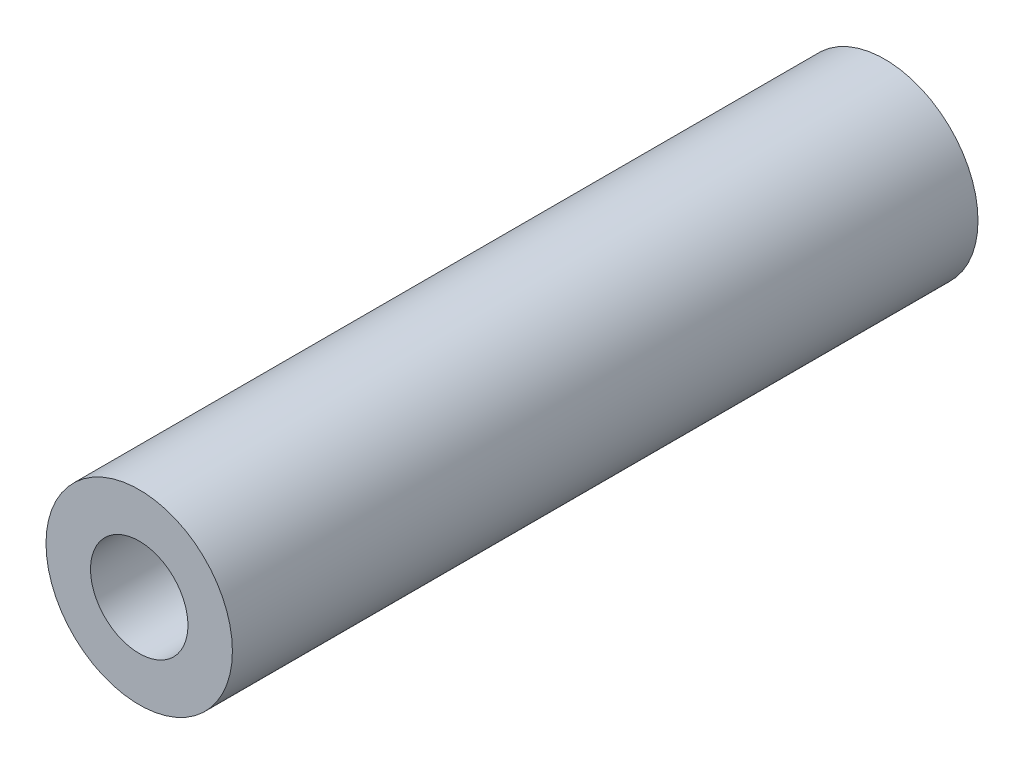
ISO-10303-21;
HEADER;
FILE_DESCRIPTION(('STEP AP214'),'2;1');
FILE_NAME('part.step','',(''),(''),'','','');
FILE_SCHEMA(('AUTOMOTIVE_DESIGN { 1 0 10303 214 1 1 1 1 }'));
ENDSEC;
DATA;
#1=APPLICATION_CONTEXT('core data for automotive mechanical design processes');
#2=APPLICATION_PROTOCOL_DEFINITION('international standard','automotive_design',2000,#1);
#3=PRODUCT_CONTEXT('',#1,'mechanical');
#4=PRODUCT('Part','Part','',(#3));
#5=PRODUCT_RELATED_PRODUCT_CATEGORY('part','',(#4));
#6=PRODUCT_DEFINITION_FORMATION('','',#4);
#7=PRODUCT_DEFINITION_CONTEXT('part definition',#1,'design');
#8=PRODUCT_DEFINITION('design','',#6,#7);
#9=PRODUCT_DEFINITION_SHAPE('','',#8);
#10=(LENGTH_UNIT() NAMED_UNIT(*) SI_UNIT(.MILLI.,.METRE.));
#11=(NAMED_UNIT(*) PLANE_ANGLE_UNIT() SI_UNIT($,.RADIAN.));
#12=(NAMED_UNIT(*) SI_UNIT($,.STERADIAN.) SOLID_ANGLE_UNIT());
#13=UNCERTAINTY_MEASURE_WITH_UNIT(LENGTH_MEASURE(1.E-05),#10,'distance_accuracy_value','');
#14=(GEOMETRIC_REPRESENTATION_CONTEXT(3) GLOBAL_UNCERTAINTY_ASSIGNED_CONTEXT((#13)) GLOBAL_UNIT_ASSIGNED_CONTEXT((#10,
#11,#12)) REPRESENTATION_CONTEXT('',''));
#15=CARTESIAN_POINT('',(0.,0.,0.));
#16=DIRECTION('',(0.,0.,1.));
#17=DIRECTION('',(1.,0.,0.));
#18=AXIS2_PLACEMENT_3D('',#15,#16,#17);
#19=CARTESIAN_POINT('',(0.,0.,38.1));
#20=DIRECTION('',(0.,0.,1.));
#21=DIRECTION('',(1.,0.,0.));
#22=AXIS2_PLACEMENT_3D('',#19,#20,#21);
#23=PLANE('',#22);
#24=CARTESIAN_POINT('',(0.,0.,38.1));
#25=DIRECTION('',(0.,0.,1.));
#26=DIRECTION('',(1.,0.,0.));
#27=AXIS2_PLACEMENT_3D('',#24,#25,#26);
#28=CIRCLE('',#27,4.7625);
#29=CARTESIAN_POINT('',(-4.7625,0.,38.1));
#30=VERTEX_POINT('',#29);
#31=EDGE_CURVE('E10',#30,#30,#28,.T.);
#32=ORIENTED_EDGE('',*,*,#31,.T.);
#33=EDGE_LOOP('',(#32));
#34=FACE_BOUND('',#33,.T.);
#35=CARTESIAN_POINT('',(0.,0.,38.1));
#36=DIRECTION('',(0.,0.,1.));
#37=DIRECTION('',(1.,0.,0.));
#38=AXIS2_PLACEMENT_3D('',#35,#36,#37);
#39=CIRCLE('',#38,2.4892);
#40=CARTESIAN_POINT('',(-2.4892,0.,38.1));
#41=VERTEX_POINT('',#40);
#42=EDGE_CURVE('E49',#41,#41,#39,.T.);
#43=ORIENTED_EDGE('',*,*,#42,.F.);
#44=EDGE_LOOP('',(#43));
#45=FACE_BOUND('',#44,.T.);
#46=ADVANCED_FACE('F38',(#34,#45),#23,.T.);
#47=CARTESIAN_POINT('',(0.,0.,0.));
#48=DIRECTION('',(0.,0.,1.));
#49=DIRECTION('',(1.,0.,0.));
#50=AXIS2_PLACEMENT_3D('',#47,#48,#49);
#51=PLANE('',#50);
#52=CARTESIAN_POINT('',(0.,0.,0.));
#53=DIRECTION('',(0.,0.,1.));
#54=DIRECTION('',(1.,0.,0.));
#55=AXIS2_PLACEMENT_3D('',#52,#53,#54);
#56=CIRCLE('',#55,4.7625);
#57=CARTESIAN_POINT('',(-4.7625,0.,0.));
#58=VERTEX_POINT('',#57);
#59=EDGE_CURVE('E42',#58,#58,#56,.T.);
#60=ORIENTED_EDGE('',*,*,#59,.F.);
#61=EDGE_LOOP('',(#60));
#62=FACE_BOUND('',#61,.T.);
#63=CARTESIAN_POINT('',(0.,0.,0.));
#64=DIRECTION('',(0.,0.,1.));
#65=DIRECTION('',(1.,0.,0.));
#66=AXIS2_PLACEMENT_3D('',#63,#64,#65);
#67=CIRCLE('',#66,2.4892);
#68=CARTESIAN_POINT('',(-2.4892,0.,0.));
#69=VERTEX_POINT('',#68);
#70=EDGE_CURVE('E51',#69,#69,#67,.T.);
#71=ORIENTED_EDGE('',*,*,#70,.T.);
#72=EDGE_LOOP('',(#71));
#73=FACE_BOUND('',#72,.T.);
#74=ADVANCED_FACE('F61',(#62,#73),#51,.F.);
#75=CARTESIAN_POINT('',(0.,0.,38.1));
#76=DIRECTION('',(0.,0.,-1.));
#77=DIRECTION('',(-1.,0.,0.));
#78=AXIS2_PLACEMENT_3D('',#75,#76,#77);
#79=CYLINDRICAL_SURFACE('',#78,4.7625);
#80=CARTESIAN_POINT('',(-4.7625,0.,38.1));
#81=CARTESIAN_POINT('',(-4.7625,0.,37.703125));
#82=CARTESIAN_POINT('',(-4.7625,0.,37.30625));
#83=CARTESIAN_POINT('',(-4.7625,0.,36.5125));
#84=CARTESIAN_POINT('',(-4.7625,0.,36.115625));
#85=CARTESIAN_POINT('',(-4.7625,0.,35.321875));
#86=CARTESIAN_POINT('',(-4.7625,0.,34.925));
#87=CARTESIAN_POINT('',(-4.7625,0.,34.13125));
#88=CARTESIAN_POINT('',(-4.7625,0.,33.734375));
#89=CARTESIAN_POINT('',(-4.7625,0.,32.940625));
#90=CARTESIAN_POINT('',(-4.7625,0.,32.54375));
#91=CARTESIAN_POINT('',(-4.7625,0.,31.75));
#92=CARTESIAN_POINT('',(-4.7625,0.,31.353125));
#93=CARTESIAN_POINT('',(-4.7625,0.,30.559375));
#94=CARTESIAN_POINT('',(-4.7625,0.,30.1625));
#95=CARTESIAN_POINT('',(-4.7625,0.,29.36875));
#96=CARTESIAN_POINT('',(-4.7625,0.,28.971875));
#97=CARTESIAN_POINT('',(-4.7625,0.,28.178125));
#98=CARTESIAN_POINT('',(-4.7625,0.,27.78125));
#99=CARTESIAN_POINT('',(-4.7625,0.,26.9875));
#100=CARTESIAN_POINT('',(-4.7625,0.,26.590625));
#101=CARTESIAN_POINT('',(-4.7625,0.,25.796875));
#102=CARTESIAN_POINT('',(-4.7625,0.,25.4));
#103=CARTESIAN_POINT('',(-4.7625,0.,24.60625));
#104=CARTESIAN_POINT('',(-4.7625,0.,24.209375));
#105=CARTESIAN_POINT('',(-4.7625,0.,23.415625));
#106=CARTESIAN_POINT('',(-4.7625,0.,23.01875));
#107=CARTESIAN_POINT('',(-4.7625,0.,22.225));
#108=CARTESIAN_POINT('',(-4.7625,0.,21.828125));
#109=CARTESIAN_POINT('',(-4.7625,0.,21.034375));
#110=CARTESIAN_POINT('',(-4.7625,0.,20.6375));
#111=CARTESIAN_POINT('',(-4.7625,0.,19.84375));
#112=CARTESIAN_POINT('',(-4.7625,0.,19.446875));
#113=CARTESIAN_POINT('',(-4.7625,0.,18.653125));
#114=CARTESIAN_POINT('',(-4.7625,0.,18.25625));
#115=CARTESIAN_POINT('',(-4.7625,0.,17.4625));
#116=CARTESIAN_POINT('',(-4.7625,0.,17.065625));
#117=CARTESIAN_POINT('',(-4.7625,0.,16.271875));
#118=CARTESIAN_POINT('',(-4.7625,0.,15.875));
#119=CARTESIAN_POINT('',(-4.7625,0.,15.08125));
#120=CARTESIAN_POINT('',(-4.7625,0.,14.684375));
#121=CARTESIAN_POINT('',(-4.7625,0.,13.890625));
#122=CARTESIAN_POINT('',(-4.7625,0.,13.49375));
#123=CARTESIAN_POINT('',(-4.7625,0.,12.7));
#124=CARTESIAN_POINT('',(-4.7625,0.,12.303125));
#125=CARTESIAN_POINT('',(-4.7625,0.,11.509375));
#126=CARTESIAN_POINT('',(-4.7625,0.,11.1125));
#127=CARTESIAN_POINT('',(-4.7625,0.,10.31875));
#128=CARTESIAN_POINT('',(-4.7625,0.,9.92187499999999));
#129=CARTESIAN_POINT('',(-4.7625,0.,9.128125));
#130=CARTESIAN_POINT('',(-4.7625,0.,8.73124999999999));
#131=CARTESIAN_POINT('',(-4.7625,0.,7.93749999999999));
#132=CARTESIAN_POINT('',(-4.7625,0.,7.54062499999999));
#133=CARTESIAN_POINT('',(-4.7625,0.,6.746875));
#134=CARTESIAN_POINT('',(-4.7625,0.,6.35));
#135=CARTESIAN_POINT('',(-4.7625,0.,5.55625));
#136=CARTESIAN_POINT('',(-4.7625,0.,5.159375));
#137=CARTESIAN_POINT('',(-4.7625,0.,4.365625));
#138=CARTESIAN_POINT('',(-4.7625,0.,3.96875));
#139=CARTESIAN_POINT('',(-4.7625,0.,3.175));
#140=CARTESIAN_POINT('',(-4.7625,0.,2.778125));
#141=CARTESIAN_POINT('',(-4.7625,0.,1.984375));
#142=CARTESIAN_POINT('',(-4.7625,0.,1.5875));
#143=CARTESIAN_POINT('',(-4.7625,0.,0.79375));
#144=CARTESIAN_POINT('',(-4.7625,0.,0.396875));
#145=CARTESIAN_POINT('',(-4.7625,0.,0.));
#146=B_SPLINE_CURVE_WITH_KNOTS('',3,(#80,#81,#82,#83,#84,#85,#86,#87,#88,#89,#90,#91,#92,#93,
#94,#95,#96,#97,#98,#99,#100,#101,#102,#103,#104,#105,#106,#107,#108,#109,#110,#111,#112,#113,
#114,#115,#116,#117,#118,#119,#120,#121,#122,#123,#124,#125,#126,#127,#128,#129,#130,#131,#132,
#133,#134,#135,#136,#137,#138,#139,#140,#141,#142,#143,#144,#145),.UNSPECIFIED.,.F.,.F.,(4,2,2,
2,2,2,2,2,2,2,2,2,2,2,2,2,2,2,2,2,2,2,2,2,2,2,2,2,2,2,2,2,4),(0.,1.190625,2.38125,3.571875,
4.7625,5.953125,7.14375,8.334375,9.52500000000001,10.715625,11.90625,13.096875,14.2875,
15.478125,16.66875,17.859375,19.05,20.240625,21.43125,22.621875,23.8125,25.003125,26.19375,
27.384375,28.575,29.765625,30.95625,32.146875,33.3375,34.528125,35.71875,36.909375,38.1),.UNSPECIFIED.);
#147=EDGE_CURVE('BSEAM40',#30,#58,#146,.T.);
#148=ORIENTED_EDGE('',*,*,#31,.F.);
#149=ORIENTED_EDGE('',*,*,#59,.T.);
#150=ORIENTED_EDGE('',*,*,#147,.T.);
#151=ORIENTED_EDGE('',*,*,#147,.F.);
#152=EDGE_LOOP('',(#148,#150,#149,#151));
#153=FACE_BOUND('',#152,.T.);
#154=ADVANCED_FACE('F40',(#153),#79,.T.);
#155=CARTESIAN_POINT('',(0.,0.,38.1));
#156=DIRECTION('',(0.,0.,-1.));
#157=DIRECTION('',(-1.,0.,0.));
#158=AXIS2_PLACEMENT_3D('',#155,#156,#157);
#159=CYLINDRICAL_SURFACE('',#158,2.4892);
#160=CARTESIAN_POINT('',(-2.4892,0.,38.1));
#161=CARTESIAN_POINT('',(-2.4892,0.,37.703125));
#162=CARTESIAN_POINT('',(-2.4892,0.,37.30625));
#163=CARTESIAN_POINT('',(-2.4892,0.,36.5125));
#164=CARTESIAN_POINT('',(-2.4892,0.,36.115625));
#165=CARTESIAN_POINT('',(-2.4892,0.,35.321875));
#166=CARTESIAN_POINT('',(-2.4892,0.,34.925));
#167=CARTESIAN_POINT('',(-2.4892,0.,34.13125));
#168=CARTESIAN_POINT('',(-2.4892,0.,33.734375));
#169=CARTESIAN_POINT('',(-2.4892,0.,32.940625));
#170=CARTESIAN_POINT('',(-2.4892,0.,32.54375));
#171=CARTESIAN_POINT('',(-2.4892,0.,31.75));
#172=CARTESIAN_POINT('',(-2.4892,0.,31.353125));
#173=CARTESIAN_POINT('',(-2.4892,0.,30.559375));
#174=CARTESIAN_POINT('',(-2.4892,0.,30.1625));
#175=CARTESIAN_POINT('',(-2.4892,0.,29.36875));
#176=CARTESIAN_POINT('',(-2.4892,0.,28.971875));
#177=CARTESIAN_POINT('',(-2.4892,0.,28.178125));
#178=CARTESIAN_POINT('',(-2.4892,0.,27.78125));
#179=CARTESIAN_POINT('',(-2.4892,0.,26.9875));
#180=CARTESIAN_POINT('',(-2.4892,0.,26.590625));
#181=CARTESIAN_POINT('',(-2.4892,0.,25.796875));
#182=CARTESIAN_POINT('',(-2.4892,0.,25.4));
#183=CARTESIAN_POINT('',(-2.4892,0.,24.60625));
#184=CARTESIAN_POINT('',(-2.4892,0.,24.209375));
#185=CARTESIAN_POINT('',(-2.4892,0.,23.415625));
#186=CARTESIAN_POINT('',(-2.4892,0.,23.01875));
#187=CARTESIAN_POINT('',(-2.4892,0.,22.225));
#188=CARTESIAN_POINT('',(-2.4892,0.,21.828125));
#189=CARTESIAN_POINT('',(-2.4892,0.,21.034375));
#190=CARTESIAN_POINT('',(-2.4892,0.,20.6375));
#191=CARTESIAN_POINT('',(-2.4892,0.,19.84375));
#192=CARTESIAN_POINT('',(-2.4892,0.,19.446875));
#193=CARTESIAN_POINT('',(-2.4892,0.,18.653125));
#194=CARTESIAN_POINT('',(-2.4892,0.,18.25625));
#195=CARTESIAN_POINT('',(-2.4892,0.,17.4625));
#196=CARTESIAN_POINT('',(-2.4892,0.,17.065625));
#197=CARTESIAN_POINT('',(-2.4892,0.,16.271875));
#198=CARTESIAN_POINT('',(-2.4892,0.,15.875));
#199=CARTESIAN_POINT('',(-2.4892,0.,15.08125));
#200=CARTESIAN_POINT('',(-2.4892,0.,14.684375));
#201=CARTESIAN_POINT('',(-2.4892,0.,13.890625));
#202=CARTESIAN_POINT('',(-2.4892,0.,13.49375));
#203=CARTESIAN_POINT('',(-2.4892,0.,12.7));
#204=CARTESIAN_POINT('',(-2.4892,0.,12.303125));
#205=CARTESIAN_POINT('',(-2.4892,0.,11.509375));
#206=CARTESIAN_POINT('',(-2.4892,0.,11.1125));
#207=CARTESIAN_POINT('',(-2.4892,0.,10.31875));
#208=CARTESIAN_POINT('',(-2.4892,0.,9.92187499999999));
#209=CARTESIAN_POINT('',(-2.4892,0.,9.128125));
#210=CARTESIAN_POINT('',(-2.4892,0.,8.73124999999999));
#211=CARTESIAN_POINT('',(-2.4892,0.,7.93749999999999));
#212=CARTESIAN_POINT('',(-2.4892,0.,7.54062499999999));
#213=CARTESIAN_POINT('',(-2.4892,0.,6.746875));
#214=CARTESIAN_POINT('',(-2.4892,0.,6.35));
#215=CARTESIAN_POINT('',(-2.4892,0.,5.55625));
#216=CARTESIAN_POINT('',(-2.4892,0.,5.159375));
#217=CARTESIAN_POINT('',(-2.4892,0.,4.365625));
#218=CARTESIAN_POINT('',(-2.4892,0.,3.96875));
#219=CARTESIAN_POINT('',(-2.4892,0.,3.175));
#220=CARTESIAN_POINT('',(-2.4892,0.,2.778125));
#221=CARTESIAN_POINT('',(-2.4892,0.,1.984375));
#222=CARTESIAN_POINT('',(-2.4892,0.,1.5875));
#223=CARTESIAN_POINT('',(-2.4892,0.,0.79375));
#224=CARTESIAN_POINT('',(-2.4892,0.,0.396875));
#225=CARTESIAN_POINT('',(-2.4892,0.,0.));
#226=B_SPLINE_CURVE_WITH_KNOTS('',3,(#160,#161,#162,#163,#164,#165,#166,#167,#168,#169,#170,
#171,#172,#173,#174,#175,#176,#177,#178,#179,#180,#181,#182,#183,#184,#185,#186,#187,#188,#189,
#190,#191,#192,#193,#194,#195,#196,#197,#198,#199,#200,#201,#202,#203,#204,#205,#206,#207,#208,
#209,#210,#211,#212,#213,#214,#215,#216,#217,#218,#219,#220,#221,#222,#223,#224,#225),
.UNSPECIFIED.,.F.,.F.,(4,2,2,2,2,2,2,2,2,2,2,2,2,2,2,2,2,2,2,2,2,2,2,2,2,2,2,2,2,2,2,2,4),(0.,
1.190625,2.38125,3.571875,4.7625,5.953125,7.14375,8.334375,9.52500000000001,10.715625,11.90625,
13.096875,14.2875,15.478125,16.66875,17.859375,19.05,20.240625,21.43125,22.621875,23.8125,
25.003125,26.19375,27.384375,28.575,29.765625,30.95625,32.146875,33.3375,34.528125,35.71875,
36.909375,38.1),.UNSPECIFIED.);
#227=EDGE_CURVE('BSEAM57',#41,#69,#226,.T.);
#228=ORIENTED_EDGE('',*,*,#42,.T.);
#229=ORIENTED_EDGE('',*,*,#70,.F.);
#230=ORIENTED_EDGE('',*,*,#227,.T.);
#231=ORIENTED_EDGE('',*,*,#227,.F.);
#232=EDGE_LOOP('',(#228,#230,#229,#231));
#233=FACE_BOUND('',#232,.T.);
#234=ADVANCED_FACE('F57',(#233),#159,.F.);
#235=CLOSED_SHELL('',(#46,#74,#154,#234));
#236=MANIFOLD_SOLID_BREP('B2',#235);
#237=ADVANCED_BREP_SHAPE_REPRESENTATION('',(#18,#236),#14);
#238=SHAPE_DEFINITION_REPRESENTATION(#9,#237);
ENDSEC;
END-ISO-10303-21;
